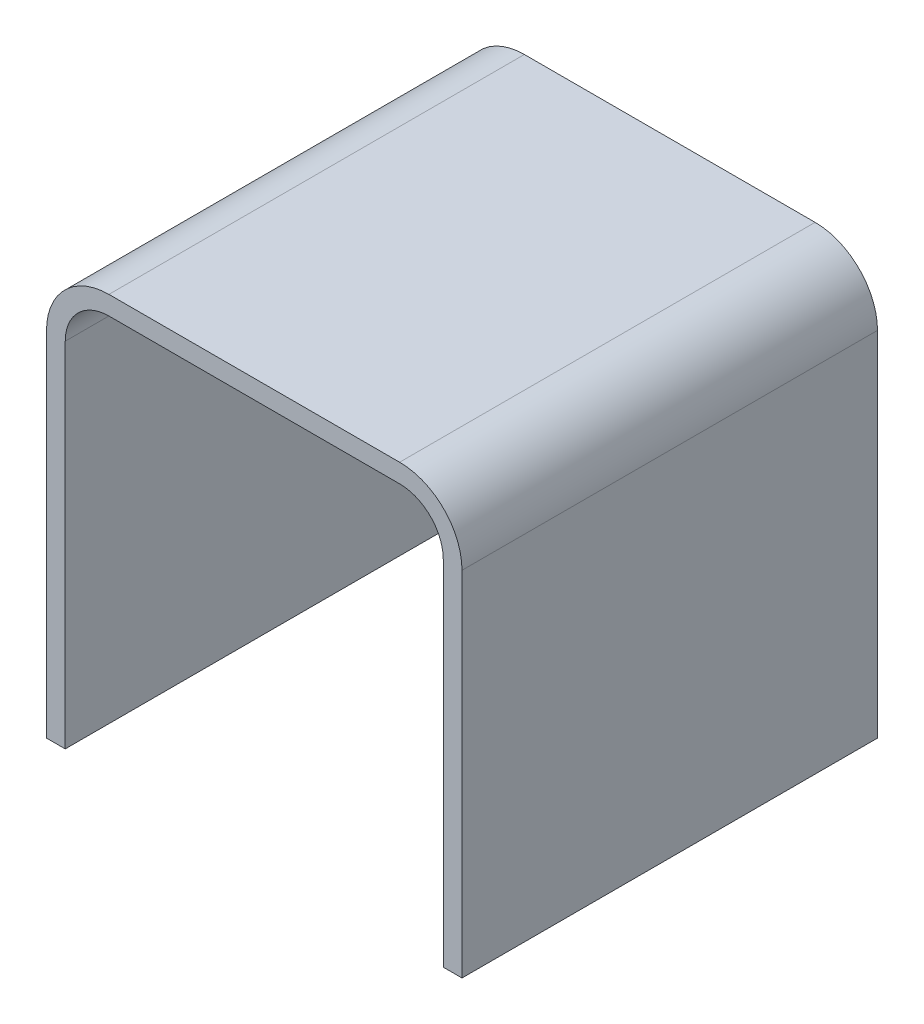
ISO-10303-21;
HEADER;
FILE_DESCRIPTION(('STEP AP214'),'2;1');
FILE_NAME('part.step','',(''),(''),'','','');
FILE_SCHEMA(('AUTOMOTIVE_DESIGN { 1 0 10303 214 1 1 1 1 }'));
ENDSEC;
DATA;
#1=APPLICATION_CONTEXT('core data for automotive mechanical design processes');
#2=APPLICATION_PROTOCOL_DEFINITION('international standard','automotive_design',2000,#1);
#3=PRODUCT_CONTEXT('',#1,'mechanical');
#4=PRODUCT('Part','Part','',(#3));
#5=PRODUCT_RELATED_PRODUCT_CATEGORY('part','',(#4));
#6=PRODUCT_DEFINITION_FORMATION('','',#4);
#7=PRODUCT_DEFINITION_CONTEXT('part definition',#1,'design');
#8=PRODUCT_DEFINITION('design','',#6,#7);
#9=PRODUCT_DEFINITION_SHAPE('','',#8);
#10=(LENGTH_UNIT() NAMED_UNIT(*) SI_UNIT(.MILLI.,.METRE.));
#11=(NAMED_UNIT(*) PLANE_ANGLE_UNIT() SI_UNIT($,.RADIAN.));
#12=(NAMED_UNIT(*) SI_UNIT($,.STERADIAN.) SOLID_ANGLE_UNIT());
#13=UNCERTAINTY_MEASURE_WITH_UNIT(LENGTH_MEASURE(1.E-05),#10,'distance_accuracy_value','');
#14=(GEOMETRIC_REPRESENTATION_CONTEXT(3) GLOBAL_UNCERTAINTY_ASSIGNED_CONTEXT((#13)) GLOBAL_UNIT_ASSIGNED_CONTEXT((#10,
#11,#12)) REPRESENTATION_CONTEXT('',''));
#15=CARTESIAN_POINT('',(0.,0.,0.));
#16=DIRECTION('',(0.,0.,1.));
#17=DIRECTION('',(1.,0.,0.));
#18=AXIS2_PLACEMENT_3D('',#15,#16,#17);
#19=CARTESIAN_POINT('',(0.,0.,3.));
#20=DIRECTION('',(0.,0.,1.));
#21=DIRECTION('',(1.,0.,0.));
#22=AXIS2_PLACEMENT_3D('',#19,#20,#21);
#23=PLANE('',#22);
#24=CARTESIAN_POINT('',(0.,12.5,3.));
#25=DIRECTION('',(0.,0.,1.));
#26=DIRECTION('',(1.,0.,0.));
#27=AXIS2_PLACEMENT_3D('',#24,#25,#26);
#28=CIRCLE('',#27,6.);
#29=CARTESIAN_POINT('',(6.,12.5,3.));
#30=VERTEX_POINT('',#29);
#31=EDGE_CURVE('E285',#30,#30,#28,.T.);
#32=ORIENTED_EDGE('',*,*,#31,.F.);
#33=EDGE_LOOP('',(#32));
#34=FACE_BOUND('',#33,.T.);
#35=DIRECTION('',(0.,-1.,0.));
#36=VECTOR('',#35,1.);
#37=CARTESIAN_POINT('',(30.3,33.3,3.));
#38=LINE('',#37,#36);
#39=CARTESIAN_POINT('',(30.3,23.3,3.));
#40=VERTEX_POINT('',#39);
#41=CARTESIAN_POINT('',(30.3,-33.3,3.));
#42=VERTEX_POINT('',#41);
#43=EDGE_CURVE('E150',#40,#42,#38,.T.);
#44=ORIENTED_EDGE('',*,*,#43,.F.);
#45=CARTESIAN_POINT('',(23.3,23.3,3.));
#46=DIRECTION('',(0.,0.,-1.));
#47=DIRECTION('',(1.,0.,0.));
#48=AXIS2_PLACEMENT_3D('',#45,#46,#47);
#49=CIRCLE('',#48,7.);
#50=CARTESIAN_POINT('',(23.3,30.3,3.));
#51=VERTEX_POINT('',#50);
#52=EDGE_CURVE('E136',#51,#40,#49,.T.);
#53=ORIENTED_EDGE('',*,*,#52,.F.);
#54=DIRECTION('',(1.,0.,0.));
#55=VECTOR('',#54,1.);
#56=CARTESIAN_POINT('',(-30.3,30.3,3.));
#57=LINE('',#56,#55);
#58=CARTESIAN_POINT('',(-23.3,30.3,3.));
#59=VERTEX_POINT('',#58);
#60=EDGE_CURVE('E144',#59,#51,#57,.T.);
#61=ORIENTED_EDGE('',*,*,#60,.F.);
#62=CARTESIAN_POINT('',(-23.3,23.3,3.));
#63=DIRECTION('',(0.,0.,-1.));
#64=DIRECTION('',(1.,0.,0.));
#65=AXIS2_PLACEMENT_3D('',#62,#63,#64);
#66=CIRCLE('',#65,7.);
#67=CARTESIAN_POINT('',(-30.3,23.3,3.));
#68=VERTEX_POINT('',#67);
#69=EDGE_CURVE('E145',#68,#59,#66,.T.);
#70=ORIENTED_EDGE('',*,*,#69,.F.);
#71=DIRECTION('',(0.,1.,0.));
#72=VECTOR('',#71,1.);
#73=CARTESIAN_POINT('',(-30.3,33.3,3.));
#74=LINE('',#73,#72);
#75=CARTESIAN_POINT('',(-30.3,-33.3,3.));
#76=VERTEX_POINT('',#75);
#77=EDGE_CURVE('E169',#76,#68,#74,.T.);
#78=ORIENTED_EDGE('',*,*,#77,.F.);
#79=DIRECTION('',(1.,0.,0.));
#80=VECTOR('',#79,1.);
#81=CARTESIAN_POINT('',(33.3,-33.3,3.));
#82=LINE('',#81,#80);
#83=EDGE_CURVE('E185',#76,#42,#82,.T.);
#84=ORIENTED_EDGE('',*,*,#83,.T.);
#85=EDGE_LOOP('',(#44,#53,#61,#70,#78,#84));
#86=FACE_BOUND('',#85,.T.);
#87=ADVANCED_FACE('F38',(#34,#86),#23,.T.);
#88=CARTESIAN_POINT('',(-30.3,30.3,66.6));
#89=DIRECTION('',(0.,1.,0.));
#90=DIRECTION('',(0.,0.,1.));
#91=AXIS2_PLACEMENT_3D('',#88,#89,#90);
#92=PLANE('',#91);
#93=DIRECTION('',(0.,0.,-1.));
#94=VECTOR('',#93,1.);
#95=CARTESIAN_POINT('',(23.3,30.3,66.6));
#96=LINE('',#95,#94);
#97=CARTESIAN_POINT('',(23.3,30.3,66.6));
#98=VERTEX_POINT('',#97);
#99=EDGE_CURVE('E129',#98,#51,#96,.T.);
#100=ORIENTED_EDGE('',*,*,#99,.F.);
#101=DIRECTION('',(1.,0.,0.));
#102=VECTOR('',#101,1.);
#103=CARTESIAN_POINT('',(-30.3,30.3,66.6));
#104=LINE('',#103,#102);
#105=CARTESIAN_POINT('',(-23.3,30.3,66.6));
#106=VERTEX_POINT('',#105);
#107=EDGE_CURVE('E142',#106,#98,#104,.T.);
#108=ORIENTED_EDGE('',*,*,#107,.F.);
#109=DIRECTION('',(0.,0.,-1.));
#110=VECTOR('',#109,1.);
#111=CARTESIAN_POINT('',(-23.3,30.3,66.6));
#112=LINE('',#111,#110);
#113=EDGE_CURVE('E53',#106,#59,#112,.T.);
#114=ORIENTED_EDGE('',*,*,#113,.T.);
#115=ORIENTED_EDGE('',*,*,#60,.T.);
#116=EDGE_LOOP('',(#100,#108,#114,#115));
#117=FACE_BOUND('',#116,.T.);
#118=ADVANCED_FACE('F141',(#117),#92,.F.);
#119=CARTESIAN_POINT('',(-30.3,33.3,66.6));
#120=DIRECTION('',(-1.,0.,0.));
#121=DIRECTION('',(0.,-1.,0.));
#122=AXIS2_PLACEMENT_3D('',#119,#120,#121);
#123=PLANE('',#122);
#124=DIRECTION('',(0.,0.,-1.));
#125=VECTOR('',#124,1.);
#126=CARTESIAN_POINT('',(-30.3,23.3,66.6));
#127=LINE('',#126,#125);
#128=CARTESIAN_POINT('',(-30.3,23.3,66.6));
#129=VERTEX_POINT('',#128);
#130=EDGE_CURVE('E270',#129,#68,#127,.T.);
#131=ORIENTED_EDGE('',*,*,#130,.F.);
#132=DIRECTION('',(0.,1.,0.));
#133=VECTOR('',#132,1.);
#134=CARTESIAN_POINT('',(-30.3,33.3,66.6));
#135=LINE('',#134,#133);
#136=CARTESIAN_POINT('',(-30.3,-33.3,66.6));
#137=VERTEX_POINT('',#136);
#138=EDGE_CURVE('E174',#137,#129,#135,.T.);
#139=ORIENTED_EDGE('',*,*,#138,.F.);
#140=DIRECTION('',(0.,0.,-1.));
#141=VECTOR('',#140,1.);
#142=CARTESIAN_POINT('',(-30.3,-33.3,66.6));
#143=LINE('',#142,#141);
#144=EDGE_CURVE('E179',#137,#76,#143,.T.);
#145=ORIENTED_EDGE('',*,*,#144,.T.);
#146=ORIENTED_EDGE('',*,*,#77,.T.);
#147=EDGE_LOOP('',(#131,#139,#145,#146));
#148=FACE_BOUND('',#147,.T.);
#149=ADVANCED_FACE('F250',(#148),#123,.F.);
#150=CARTESIAN_POINT('',(33.3,-33.3,3.));
#151=DIRECTION('',(-1.,0.,0.));
#152=DIRECTION('',(0.,0.,1.));
#153=AXIS2_PLACEMENT_3D('',#150,#151,#152);
#154=PLANE('',#153);
#155=DIRECTION('',(0.,0.,1.));
#156=VECTOR('',#155,1.);
#157=CARTESIAN_POINT('',(33.3,23.3,0.));
#158=LINE('',#157,#156);
#159=CARTESIAN_POINT('',(33.3,23.3,0.));
#160=VERTEX_POINT('',#159);
#161=CARTESIAN_POINT('',(33.3,23.3,66.6));
#162=VERTEX_POINT('',#161);
#163=EDGE_CURVE('E214',#160,#162,#158,.T.);
#164=ORIENTED_EDGE('',*,*,#163,.T.);
#165=DIRECTION('',(0.,1.,0.));
#166=VECTOR('',#165,1.);
#167=CARTESIAN_POINT('',(33.3,33.3,66.6));
#168=LINE('',#167,#166);
#169=CARTESIAN_POINT('',(33.3,-33.3,66.6));
#170=VERTEX_POINT('',#169);
#171=EDGE_CURVE('E152',#170,#162,#168,.T.);
#172=ORIENTED_EDGE('',*,*,#171,.F.);
#173=DIRECTION('',(0.,0.,-1.));
#174=VECTOR('',#173,1.);
#175=CARTESIAN_POINT('',(33.3,-33.3,3.));
#176=LINE('',#175,#174);
#177=CARTESIAN_POINT('',(33.3,-33.3,0.));
#178=VERTEX_POINT('',#177);
#179=EDGE_CURVE('E46',#170,#178,#176,.T.);
#180=ORIENTED_EDGE('',*,*,#179,.T.);
#181=DIRECTION('',(0.,1.,0.));
#182=VECTOR('',#181,1.);
#183=CARTESIAN_POINT('',(33.3,-33.3,0.));
#184=LINE('',#183,#182);
#185=EDGE_CURVE('E192',#178,#160,#184,.T.);
#186=ORIENTED_EDGE('',*,*,#185,.T.);
#187=EDGE_LOOP('',(#164,#172,#180,#186));
#188=FACE_BOUND('',#187,.T.);
#189=ADVANCED_FACE('F201',(#188),#154,.F.);
#190=CARTESIAN_POINT('',(33.3,33.3,3.));
#191=DIRECTION('',(0.,-1.,0.));
#192=DIRECTION('',(0.,0.,-1.));
#193=AXIS2_PLACEMENT_3D('',#190,#191,#192);
#194=PLANE('',#193);
#195=DIRECTION('',(0.,0.,1.));
#196=VECTOR('',#195,1.);
#197=CARTESIAN_POINT('',(-23.3,33.3,0.));
#198=LINE('',#197,#196);
#199=CARTESIAN_POINT('',(-23.3,33.3,0.));
#200=VERTEX_POINT('',#199);
#201=CARTESIAN_POINT('',(-23.3,33.3,66.6));
#202=VERTEX_POINT('',#201);
#203=EDGE_CURVE('E217',#200,#202,#198,.T.);
#204=ORIENTED_EDGE('',*,*,#203,.T.);
#205=DIRECTION('',(-1.,0.,0.));
#206=VECTOR('',#205,1.);
#207=CARTESIAN_POINT('',(-33.3,33.3,66.6));
#208=LINE('',#207,#206);
#209=CARTESIAN_POINT('',(23.3,33.3,66.6));
#210=VERTEX_POINT('',#209);
#211=EDGE_CURVE('E176',#210,#202,#208,.T.);
#212=ORIENTED_EDGE('',*,*,#211,.F.);
#213=DIRECTION('',(0.,0.,1.));
#214=VECTOR('',#213,1.);
#215=CARTESIAN_POINT('',(23.3,33.3,0.));
#216=LINE('',#215,#214);
#217=CARTESIAN_POINT('',(23.3,33.3,0.));
#218=VERTEX_POINT('',#217);
#219=EDGE_CURVE('E61',#218,#210,#216,.T.);
#220=ORIENTED_EDGE('',*,*,#219,.F.);
#221=DIRECTION('',(-1.,0.,0.));
#222=VECTOR('',#221,1.);
#223=CARTESIAN_POINT('',(33.3,33.3,0.));
#224=LINE('',#223,#222);
#225=EDGE_CURVE('E188',#218,#200,#224,.T.);
#226=ORIENTED_EDGE('',*,*,#225,.T.);
#227=EDGE_LOOP('',(#204,#212,#220,#226));
#228=FACE_BOUND('',#227,.T.);
#229=ADVANCED_FACE('F230',(#228),#194,.F.);
#230=CARTESIAN_POINT('',(0.,0.,0.));
#231=DIRECTION('',(0.,0.,1.));
#232=DIRECTION('',(1.,0.,0.));
#233=AXIS2_PLACEMENT_3D('',#230,#231,#232);
#234=PLANE('',#233);
#235=CARTESIAN_POINT('',(0.,12.5,0.));
#236=DIRECTION('',(0.,0.,1.));
#237=DIRECTION('',(1.,0.,0.));
#238=AXIS2_PLACEMENT_3D('',#235,#236,#237);
#239=CIRCLE('',#238,6.);
#240=CARTESIAN_POINT('',(6.,12.5,0.));
#241=VERTEX_POINT('',#240);
#242=EDGE_CURVE('E283',#241,#241,#239,.T.);
#243=ORIENTED_EDGE('',*,*,#242,.T.);
#244=EDGE_LOOP('',(#243));
#245=FACE_BOUND('',#244,.T.);
#246=DIRECTION('',(0.,-1.,0.));
#247=VECTOR('',#246,1.);
#248=CARTESIAN_POINT('',(-33.3,-33.3,0.));
#249=LINE('',#248,#247);
#250=CARTESIAN_POINT('',(-33.3,23.3,0.));
#251=VERTEX_POINT('',#250);
#252=CARTESIAN_POINT('',(-33.3,-33.3,0.));
#253=VERTEX_POINT('',#252);
#254=EDGE_CURVE('E184',#251,#253,#249,.T.);
#255=ORIENTED_EDGE('',*,*,#254,.F.);
#256=CARTESIAN_POINT('',(-23.3,23.3,0.));
#257=DIRECTION('',(0.,0.,-1.));
#258=DIRECTION('',(1.,0.,0.));
#259=AXIS2_PLACEMENT_3D('',#256,#257,#258);
#260=CIRCLE('',#259,10.);
#261=EDGE_CURVE('E220',#251,#200,#260,.T.);
#262=ORIENTED_EDGE('',*,*,#261,.T.);
#263=ORIENTED_EDGE('',*,*,#225,.F.);
#264=CARTESIAN_POINT('',(23.3,23.3,0.));
#265=DIRECTION('',(0.,0.,-1.));
#266=DIRECTION('',(1.,0.,0.));
#267=AXIS2_PLACEMENT_3D('',#264,#265,#266);
#268=CIRCLE('',#267,10.);
#269=EDGE_CURVE('E210',#218,#160,#268,.T.);
#270=ORIENTED_EDGE('',*,*,#269,.T.);
#271=ORIENTED_EDGE('',*,*,#185,.F.);
#272=DIRECTION('',(1.,0.,0.));
#273=VECTOR('',#272,1.);
#274=CARTESIAN_POINT('',(33.3,-33.3,0.));
#275=LINE('',#274,#273);
#276=EDGE_CURVE('E190',#253,#178,#275,.T.);
#277=ORIENTED_EDGE('',*,*,#276,.F.);
#278=EDGE_LOOP('',(#255,#262,#263,#270,#271,#277));
#279=FACE_BOUND('',#278,.T.);
#280=ADVANCED_FACE('F208',(#245,#279),#234,.F.);
#281=CARTESIAN_POINT('',(0.,0.,66.6));
#282=DIRECTION('',(0.,0.,1.));
#283=DIRECTION('',(1.,0.,0.));
#284=AXIS2_PLACEMENT_3D('',#281,#282,#283);
#285=PLANE('',#284);
#286=CARTESIAN_POINT('',(23.3,23.3,66.6));
#287=DIRECTION('',(0.,0.,-1.));
#288=DIRECTION('',(1.,0.,0.));
#289=AXIS2_PLACEMENT_3D('',#286,#287,#288);
#290=CIRCLE('',#289,7.);
#291=CARTESIAN_POINT('',(30.3,23.3,66.6));
#292=VERTEX_POINT('',#291);
#293=EDGE_CURVE('E126',#98,#292,#290,.T.);
#294=ORIENTED_EDGE('',*,*,#293,.T.);
#295=DIRECTION('',(0.,-1.,0.));
#296=VECTOR('',#295,1.);
#297=CARTESIAN_POINT('',(30.3,33.3,66.6));
#298=LINE('',#297,#296);
#299=CARTESIAN_POINT('',(30.3,-33.3,66.6));
#300=VERTEX_POINT('',#299);
#301=EDGE_CURVE('E161',#292,#300,#298,.T.);
#302=ORIENTED_EDGE('',*,*,#301,.T.);
#303=DIRECTION('',(1.,0.,0.));
#304=VECTOR('',#303,1.);
#305=CARTESIAN_POINT('',(33.3,-33.3,66.6));
#306=LINE('',#305,#304);
#307=EDGE_CURVE('E163',#300,#170,#306,.T.);
#308=ORIENTED_EDGE('',*,*,#307,.T.);
#309=ORIENTED_EDGE('',*,*,#171,.T.);
#310=CARTESIAN_POINT('',(23.3,23.3,66.6));
#311=DIRECTION('',(0.,0.,-1.));
#312=DIRECTION('',(1.,0.,0.));
#313=AXIS2_PLACEMENT_3D('',#310,#311,#312);
#314=CIRCLE('',#313,10.);
#315=EDGE_CURVE('E212',#210,#162,#314,.T.);
#316=ORIENTED_EDGE('',*,*,#315,.F.);
#317=ORIENTED_EDGE('',*,*,#211,.T.);
#318=CARTESIAN_POINT('',(-23.3,23.3,66.6));
#319=DIRECTION('',(0.,0.,-1.));
#320=DIRECTION('',(1.,0.,0.));
#321=AXIS2_PLACEMENT_3D('',#318,#319,#320);
#322=CIRCLE('',#321,10.);
#323=CARTESIAN_POINT('',(-33.3,23.3,66.6));
#324=VERTEX_POINT('',#323);
#325=EDGE_CURVE('E219',#324,#202,#322,.T.);
#326=ORIENTED_EDGE('',*,*,#325,.F.);
#327=DIRECTION('',(0.,-1.,0.));
#328=VECTOR('',#327,1.);
#329=CARTESIAN_POINT('',(-33.3,33.3,66.6));
#330=LINE('',#329,#328);
#331=CARTESIAN_POINT('',(-33.3,-33.3,66.6));
#332=VERTEX_POINT('',#331);
#333=EDGE_CURVE('E170',#324,#332,#330,.T.);
#334=ORIENTED_EDGE('',*,*,#333,.T.);
#335=DIRECTION('',(1.,0.,0.));
#336=VECTOR('',#335,1.);
#337=CARTESIAN_POINT('',(-33.3,-33.3,66.6));
#338=LINE('',#337,#336);
#339=EDGE_CURVE('E172',#332,#137,#338,.T.);
#340=ORIENTED_EDGE('',*,*,#339,.T.);
#341=ORIENTED_EDGE('',*,*,#138,.T.);
#342=CARTESIAN_POINT('',(-23.3,23.3,66.6));
#343=DIRECTION('',(0.,0.,-1.));
#344=DIRECTION('',(1.,0.,0.));
#345=AXIS2_PLACEMENT_3D('',#342,#343,#344);
#346=CIRCLE('',#345,7.);
#347=EDGE_CURVE('E149',#129,#106,#346,.T.);
#348=ORIENTED_EDGE('',*,*,#347,.T.);
#349=ORIENTED_EDGE('',*,*,#107,.T.);
#350=EDGE_LOOP('',(#294,#302,#308,#309,#316,#317,#326,#334,#340,#341,#348,#349));
#351=FACE_BOUND('',#350,.T.);
#352=ADVANCED_FACE('F147',(#351),#285,.T.);
#353=CARTESIAN_POINT('',(30.3,33.3,66.6));
#354=DIRECTION('',(1.,0.,0.));
#355=DIRECTION('',(0.,1.,0.));
#356=AXIS2_PLACEMENT_3D('',#353,#354,#355);
#357=PLANE('',#356);
#358=ORIENTED_EDGE('',*,*,#301,.F.);
#359=DIRECTION('',(0.,0.,-1.));
#360=VECTOR('',#359,1.);
#361=CARTESIAN_POINT('',(30.3,23.3,66.6));
#362=LINE('',#361,#360);
#363=EDGE_CURVE('E132',#292,#40,#362,.T.);
#364=ORIENTED_EDGE('',*,*,#363,.T.);
#365=ORIENTED_EDGE('',*,*,#43,.T.);
#366=DIRECTION('',(0.,0.,-1.));
#367=VECTOR('',#366,1.);
#368=CARTESIAN_POINT('',(30.3,-33.3,66.6));
#369=LINE('',#368,#367);
#370=EDGE_CURVE('E165',#300,#42,#369,.T.);
#371=ORIENTED_EDGE('',*,*,#370,.F.);
#372=EDGE_LOOP('',(#358,#364,#365,#371));
#373=FACE_BOUND('',#372,.T.);
#374=ADVANCED_FACE('F338',(#373),#357,.F.);
#375=CARTESIAN_POINT('',(-33.3,-33.3,3.));
#376=DIRECTION('',(1.,0.,0.));
#377=DIRECTION('',(0.,0.,-1.));
#378=AXIS2_PLACEMENT_3D('',#375,#376,#377);
#379=PLANE('',#378);
#380=ORIENTED_EDGE('',*,*,#333,.F.);
#381=DIRECTION('',(0.,0.,1.));
#382=VECTOR('',#381,1.);
#383=CARTESIAN_POINT('',(-33.3,23.3,0.));
#384=LINE('',#383,#382);
#385=EDGE_CURVE('E154',#251,#324,#384,.T.);
#386=ORIENTED_EDGE('',*,*,#385,.F.);
#387=ORIENTED_EDGE('',*,*,#254,.T.);
#388=DIRECTION('',(0.,0.,-1.));
#389=VECTOR('',#388,1.);
#390=CARTESIAN_POINT('',(-33.3,-33.3,3.));
#391=LINE('',#390,#389);
#392=EDGE_CURVE('E11',#332,#253,#391,.T.);
#393=ORIENTED_EDGE('',*,*,#392,.F.);
#394=EDGE_LOOP('',(#380,#386,#387,#393));
#395=FACE_BOUND('',#394,.T.);
#396=ADVANCED_FACE('F40',(#395),#379,.F.);
#397=CARTESIAN_POINT('',(33.3,-33.3,3.));
#398=DIRECTION('',(0.,1.,0.));
#399=DIRECTION('',(-1.,0.,0.));
#400=AXIS2_PLACEMENT_3D('',#397,#398,#399);
#401=PLANE('',#400);
#402=ORIENTED_EDGE('',*,*,#276,.T.);
#403=ORIENTED_EDGE('',*,*,#179,.F.);
#404=ORIENTED_EDGE('',*,*,#307,.F.);
#405=ORIENTED_EDGE('',*,*,#370,.T.);
#406=ORIENTED_EDGE('',*,*,#83,.F.);
#407=ORIENTED_EDGE('',*,*,#144,.F.);
#408=ORIENTED_EDGE('',*,*,#339,.F.);
#409=ORIENTED_EDGE('',*,*,#392,.T.);
#410=EDGE_LOOP('',(#402,#403,#404,#405,#406,#407,#408,#409));
#411=FACE_BOUND('',#410,.T.);
#412=ADVANCED_FACE('F235',(#411),#401,.F.);
#413=CARTESIAN_POINT('',(23.3,23.3,0.));
#414=DIRECTION('',(0.,0.,1.));
#415=DIRECTION('',(1.,0.,0.));
#416=AXIS2_PLACEMENT_3D('',#413,#414,#415);
#417=CYLINDRICAL_SURFACE('',#416,10.);
#418=ORIENTED_EDGE('',*,*,#315,.T.);
#419=ORIENTED_EDGE('',*,*,#163,.F.);
#420=ORIENTED_EDGE('',*,*,#269,.F.);
#421=ORIENTED_EDGE('',*,*,#219,.T.);
#422=EDGE_LOOP('',(#418,#419,#420,#421));
#423=FACE_BOUND('',#422,.T.);
#424=ADVANCED_FACE('F232',(#423),#417,.T.);
#425=CARTESIAN_POINT('',(-23.3,23.3,0.));
#426=DIRECTION('',(0.,0.,1.));
#427=DIRECTION('',(1.,0.,0.));
#428=AXIS2_PLACEMENT_3D('',#425,#426,#427);
#429=CYLINDRICAL_SURFACE('',#428,10.);
#430=ORIENTED_EDGE('',*,*,#325,.T.);
#431=ORIENTED_EDGE('',*,*,#203,.F.);
#432=ORIENTED_EDGE('',*,*,#261,.F.);
#433=ORIENTED_EDGE('',*,*,#385,.T.);
#434=EDGE_LOOP('',(#430,#431,#432,#433));
#435=FACE_BOUND('',#434,.T.);
#436=ADVANCED_FACE('F234',(#435),#429,.T.);
#437=CARTESIAN_POINT('',(-23.3,23.3,66.6));
#438=DIRECTION('',(0.,0.,-1.));
#439=DIRECTION('',(-1.,0.,0.));
#440=AXIS2_PLACEMENT_3D('',#437,#438,#439);
#441=CYLINDRICAL_SURFACE('',#440,7.);
#442=ORIENTED_EDGE('',*,*,#69,.T.);
#443=ORIENTED_EDGE('',*,*,#113,.F.);
#444=ORIENTED_EDGE('',*,*,#347,.F.);
#445=ORIENTED_EDGE('',*,*,#130,.T.);
#446=EDGE_LOOP('',(#442,#443,#444,#445));
#447=FACE_BOUND('',#446,.T.);
#448=ADVANCED_FACE('F241',(#447),#441,.F.);
#449=CARTESIAN_POINT('',(23.3,23.3,66.6));
#450=DIRECTION('',(0.,0.,-1.));
#451=DIRECTION('',(-1.,0.,0.));
#452=AXIS2_PLACEMENT_3D('',#449,#450,#451);
#453=CYLINDRICAL_SURFACE('',#452,7.);
#454=ORIENTED_EDGE('',*,*,#52,.T.);
#455=ORIENTED_EDGE('',*,*,#363,.F.);
#456=ORIENTED_EDGE('',*,*,#293,.F.);
#457=ORIENTED_EDGE('',*,*,#99,.T.);
#458=EDGE_LOOP('',(#454,#455,#456,#457));
#459=FACE_BOUND('',#458,.T.);
#460=ADVANCED_FACE('F128',(#459),#453,.F.);
#461=CARTESIAN_POINT('',(0.,12.5,0.));
#462=DIRECTION('',(0.,0.,1.));
#463=DIRECTION('',(1.,0.,0.));
#464=AXIS2_PLACEMENT_3D('',#461,#462,#463);
#465=CYLINDRICAL_SURFACE('',#464,6.);
#466=ORIENTED_EDGE('',*,*,#242,.F.);
#467=EDGE_LOOP('',(#466));
#468=FACE_BOUND('',#467,.T.);
#469=ORIENTED_EDGE('',*,*,#31,.T.);
#470=EDGE_LOOP('',(#469));
#471=FACE_BOUND('',#470,.T.);
#472=ADVANCED_FACE('F291',(#468,#471),#465,.F.);
#473=CLOSED_SHELL('',(#87,#118,#149,#189,#229,#280,#352,#374,#396,#412,#424,#436,#448,#460,#472));
#474=MANIFOLD_SOLID_BREP('B2',#473);
#475=ADVANCED_BREP_SHAPE_REPRESENTATION('',(#18,#474),#14);
#476=SHAPE_DEFINITION_REPRESENTATION(#9,#475);
ENDSEC;
END-ISO-10303-21;
